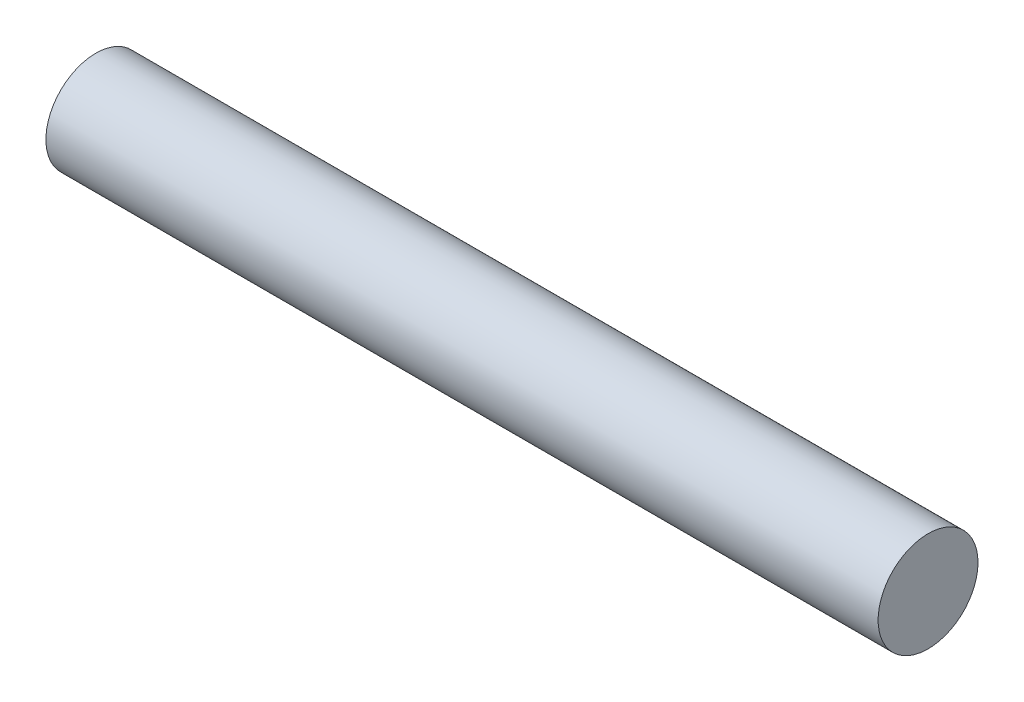
ISO-10303-21;
HEADER;
FILE_DESCRIPTION(('STEP AP214'),'2;1');
FILE_NAME('part.step','',(''),(''),'','','');
FILE_SCHEMA(('AUTOMOTIVE_DESIGN { 1 0 10303 214 1 1 1 1 }'));
ENDSEC;
DATA;
#1=APPLICATION_CONTEXT('core data for automotive mechanical design processes');
#2=APPLICATION_PROTOCOL_DEFINITION('international standard','automotive_design',2000,#1);
#3=PRODUCT_CONTEXT('',#1,'mechanical');
#4=PRODUCT('Part','Part','',(#3));
#5=PRODUCT_RELATED_PRODUCT_CATEGORY('part','',(#4));
#6=PRODUCT_DEFINITION_FORMATION('','',#4);
#7=PRODUCT_DEFINITION_CONTEXT('part definition',#1,'design');
#8=PRODUCT_DEFINITION('design','',#6,#7);
#9=PRODUCT_DEFINITION_SHAPE('','',#8);
#10=(LENGTH_UNIT() NAMED_UNIT(*) SI_UNIT(.MILLI.,.METRE.));
#11=(NAMED_UNIT(*) PLANE_ANGLE_UNIT() SI_UNIT($,.RADIAN.));
#12=(NAMED_UNIT(*) SI_UNIT($,.STERADIAN.) SOLID_ANGLE_UNIT());
#13=UNCERTAINTY_MEASURE_WITH_UNIT(LENGTH_MEASURE(1.E-05),#10,'distance_accuracy_value','');
#14=(GEOMETRIC_REPRESENTATION_CONTEXT(3) GLOBAL_UNCERTAINTY_ASSIGNED_CONTEXT((#13)) GLOBAL_UNIT_ASSIGNED_CONTEXT((#10,
#11,#12)) REPRESENTATION_CONTEXT('',''));
#15=CARTESIAN_POINT('',(0.,0.,0.));
#16=DIRECTION('',(0.,0.,1.));
#17=DIRECTION('',(1.,0.,0.));
#18=AXIS2_PLACEMENT_3D('',#15,#16,#17);
#19=CARTESIAN_POINT('',(597.,602.499999999999,515.000000000015));
#20=DIRECTION('',(1.,0.,0.));
#21=DIRECTION('',(0.,0.,-1.));
#22=AXIS2_PLACEMENT_3D('',#19,#20,#21);
#23=PLANE('',#22);
#24=CARTESIAN_POINT('',(597.,602.499999999999,515.000000000015));
#25=DIRECTION('',(1.,0.,0.));
#26=DIRECTION('',(0.,0.,-1.));
#27=AXIS2_PLACEMENT_3D('',#24,#25,#26);
#28=CIRCLE('',#27,9.00000000000001);
#29=CARTESIAN_POINT('',(597.,602.499999999999,506.000000000015));
#30=VERTEX_POINT('',#29);
#31=EDGE_CURVE('E39',#30,#30,#28,.T.);
#32=ORIENTED_EDGE('',*,*,#31,.F.);
#33=EDGE_LOOP('',(#32));
#34=FACE_BOUND('',#33,.T.);
#35=ADVANCED_FACE('F33',(#34),#23,.F.);
#36=CARTESIAN_POINT('',(747.,602.499999999999,515.000000000015));
#37=DIRECTION('',(1.,0.,0.));
#38=DIRECTION('',(0.,0.,-1.));
#39=AXIS2_PLACEMENT_3D('',#36,#37,#38);
#40=PLANE('',#39);
#41=CARTESIAN_POINT('',(747.,602.499999999999,515.000000000015));
#42=DIRECTION('',(1.,0.,0.));
#43=DIRECTION('',(0.,0.,-1.));
#44=AXIS2_PLACEMENT_3D('',#41,#42,#43);
#45=CIRCLE('',#44,9.00000000000001);
#46=CARTESIAN_POINT('',(747.,602.499999999999,506.000000000015));
#47=VERTEX_POINT('',#46);
#48=EDGE_CURVE('E10',#47,#47,#45,.T.);
#49=ORIENTED_EDGE('',*,*,#48,.T.);
#50=EDGE_LOOP('',(#49));
#51=FACE_BOUND('',#50,.T.);
#52=ADVANCED_FACE('F48',(#51),#40,.T.);
#53=CARTESIAN_POINT('',(597.,602.499999999999,515.000000000015));
#54=DIRECTION('',(1.,0.,0.));
#55=DIRECTION('',(0.,0.,-1.));
#56=AXIS2_PLACEMENT_3D('',#53,#54,#55);
#57=CYLINDRICAL_SURFACE('',#56,9.00000000000001);
#58=ORIENTED_EDGE('',*,*,#48,.F.);
#59=EDGE_LOOP('',(#58));
#60=FACE_BOUND('',#59,.T.);
#61=ORIENTED_EDGE('',*,*,#31,.T.);
#62=EDGE_LOOP('',(#61));
#63=FACE_BOUND('',#62,.T.);
#64=ADVANCED_FACE('F45',(#60,#63),#57,.T.);
#65=CLOSED_SHELL('',(#35,#52,#64));
#66=MANIFOLD_SOLID_BREP('B2',#65);
#67=ADVANCED_BREP_SHAPE_REPRESENTATION('',(#18,#66),#14);
#68=SHAPE_DEFINITION_REPRESENTATION(#9,#67);
ENDSEC;
END-ISO-10303-21;
